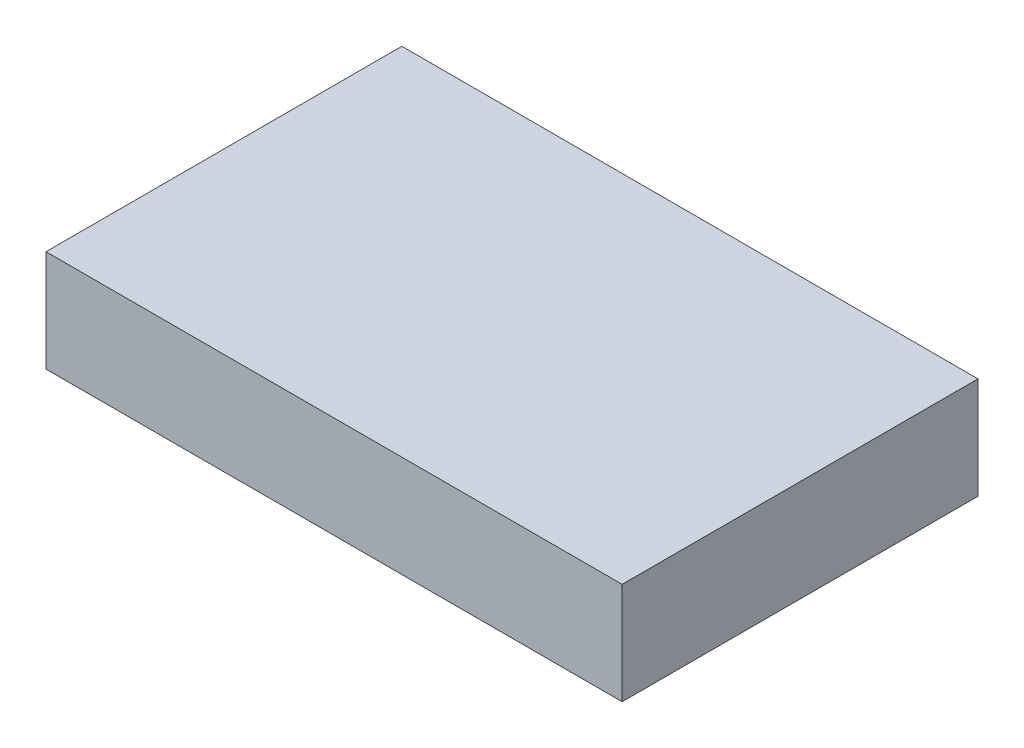
ISO-10303-21;
HEADER;
FILE_DESCRIPTION(('STEP AP214'),'2;1');
FILE_NAME('part.step','',(''),(''),'','','');
FILE_SCHEMA(('AUTOMOTIVE_DESIGN { 1 0 10303 214 1 1 1 1 }'));
ENDSEC;
DATA;
#1=APPLICATION_CONTEXT('core data for automotive mechanical design processes');
#2=APPLICATION_PROTOCOL_DEFINITION('international standard','automotive_design',2000,#1);
#3=PRODUCT_CONTEXT('',#1,'mechanical');
#4=PRODUCT('Part','Part','',(#3));
#5=PRODUCT_RELATED_PRODUCT_CATEGORY('part','',(#4));
#6=PRODUCT_DEFINITION_FORMATION('','',#4);
#7=PRODUCT_DEFINITION_CONTEXT('part definition',#1,'design');
#8=PRODUCT_DEFINITION('design','',#6,#7);
#9=PRODUCT_DEFINITION_SHAPE('','',#8);
#10=(LENGTH_UNIT() NAMED_UNIT(*) SI_UNIT(.MILLI.,.METRE.));
#11=(NAMED_UNIT(*) PLANE_ANGLE_UNIT() SI_UNIT($,.RADIAN.));
#12=(NAMED_UNIT(*) SI_UNIT($,.STERADIAN.) SOLID_ANGLE_UNIT());
#13=UNCERTAINTY_MEASURE_WITH_UNIT(LENGTH_MEASURE(1.E-05),#10,'distance_accuracy_value','');
#14=(GEOMETRIC_REPRESENTATION_CONTEXT(3) GLOBAL_UNCERTAINTY_ASSIGNED_CONTEXT((#13)) GLOBAL_UNIT_ASSIGNED_CONTEXT((#10,
#11,#12)) REPRESENTATION_CONTEXT('',''));
#15=CARTESIAN_POINT('',(0.,0.,0.));
#16=DIRECTION('',(0.,0.,1.));
#17=DIRECTION('',(1.,0.,0.));
#18=AXIS2_PLACEMENT_3D('',#15,#16,#17);
#19=CARTESIAN_POINT('',(17.,6.,10.5));
#20=DIRECTION('',(-1.,0.,0.));
#21=DIRECTION('',(0.,0.,1.));
#22=AXIS2_PLACEMENT_3D('',#19,#20,#21);
#23=PLANE('',#22);
#24=DIRECTION('',(0.,0.,-1.));
#25=VECTOR('',#24,1.);
#26=CARTESIAN_POINT('',(17.,0.,10.5));
#27=LINE('',#26,#25);
#28=CARTESIAN_POINT('',(17.,0.,10.5));
#29=VERTEX_POINT('',#28);
#30=CARTESIAN_POINT('',(17.,0.,-10.5));
#31=VERTEX_POINT('',#30);
#32=EDGE_CURVE('E113',#29,#31,#27,.T.);
#33=ORIENTED_EDGE('',*,*,#32,.T.);
#34=DIRECTION('',(0.,-1.,0.));
#35=VECTOR('',#34,1.);
#36=CARTESIAN_POINT('',(17.,6.,-10.5));
#37=LINE('',#36,#35);
#38=CARTESIAN_POINT('',(17.,6.,-10.5));
#39=VERTEX_POINT('',#38);
#40=EDGE_CURVE('E11',#39,#31,#37,.T.);
#41=ORIENTED_EDGE('',*,*,#40,.F.);
#42=DIRECTION('',(0.,0.,-1.));
#43=VECTOR('',#42,1.);
#44=CARTESIAN_POINT('',(17.,6.,10.5));
#45=LINE('',#44,#43);
#46=CARTESIAN_POINT('',(17.,6.,10.5));
#47=VERTEX_POINT('',#46);
#48=EDGE_CURVE('E97',#47,#39,#45,.T.);
#49=ORIENTED_EDGE('',*,*,#48,.F.);
#50=DIRECTION('',(0.,-1.,0.));
#51=VECTOR('',#50,1.);
#52=CARTESIAN_POINT('',(17.,6.,10.5));
#53=LINE('',#52,#51);
#54=EDGE_CURVE('E109',#47,#29,#53,.T.);
#55=ORIENTED_EDGE('',*,*,#54,.T.);
#56=EDGE_LOOP('',(#33,#41,#49,#55));
#57=FACE_BOUND('',#56,.T.);
#58=ADVANCED_FACE('F45',(#57),#23,.F.);
#59=CARTESIAN_POINT('',(-17.,6.,-10.5));
#60=DIRECTION('',(0.,0.,1.));
#61=DIRECTION('',(1.,0.,0.));
#62=AXIS2_PLACEMENT_3D('',#59,#60,#61);
#63=PLANE('',#62);
#64=DIRECTION('',(-1.,0.,0.));
#65=VECTOR('',#64,1.);
#66=CARTESIAN_POINT('',(-17.,0.,-10.5));
#67=LINE('',#66,#65);
#68=CARTESIAN_POINT('',(-17.,0.,-10.5));
#69=VERTEX_POINT('',#68);
#70=EDGE_CURVE('E102',#31,#69,#67,.T.);
#71=ORIENTED_EDGE('',*,*,#70,.T.);
#72=DIRECTION('',(0.,-1.,0.));
#73=VECTOR('',#72,1.);
#74=CARTESIAN_POINT('',(-17.,6.,-10.5));
#75=LINE('',#74,#73);
#76=CARTESIAN_POINT('',(-17.,6.,-10.5));
#77=VERTEX_POINT('',#76);
#78=EDGE_CURVE('E54',#77,#69,#75,.T.);
#79=ORIENTED_EDGE('',*,*,#78,.F.);
#80=DIRECTION('',(-1.,0.,0.));
#81=VECTOR('',#80,1.);
#82=CARTESIAN_POINT('',(-17.,6.,-10.5));
#83=LINE('',#82,#81);
#84=EDGE_CURVE('E92',#39,#77,#83,.T.);
#85=ORIENTED_EDGE('',*,*,#84,.F.);
#86=ORIENTED_EDGE('',*,*,#40,.T.);
#87=EDGE_LOOP('',(#71,#79,#85,#86));
#88=FACE_BOUND('',#87,.T.);
#89=ADVANCED_FACE('F101',(#88),#63,.F.);
#90=CARTESIAN_POINT('',(-17.,6.,10.5));
#91=DIRECTION('',(1.,0.,0.));
#92=DIRECTION('',(0.,0.,-1.));
#93=AXIS2_PLACEMENT_3D('',#90,#91,#92);
#94=PLANE('',#93);
#95=DIRECTION('',(0.,0.,1.));
#96=VECTOR('',#95,1.);
#97=CARTESIAN_POINT('',(-17.,0.,10.5));
#98=LINE('',#97,#96);
#99=CARTESIAN_POINT('',(-17.,0.,10.5));
#100=VERTEX_POINT('',#99);
#101=EDGE_CURVE('E79',#69,#100,#98,.T.);
#102=ORIENTED_EDGE('',*,*,#101,.T.);
#103=DIRECTION('',(0.,-1.,0.));
#104=VECTOR('',#103,1.);
#105=CARTESIAN_POINT('',(-17.,6.,10.5));
#106=LINE('',#105,#104);
#107=CARTESIAN_POINT('',(-17.,6.,10.5));
#108=VERTEX_POINT('',#107);
#109=EDGE_CURVE('E104',#108,#100,#106,.T.);
#110=ORIENTED_EDGE('',*,*,#109,.F.);
#111=DIRECTION('',(0.,0.,1.));
#112=VECTOR('',#111,1.);
#113=CARTESIAN_POINT('',(-17.,6.,10.5));
#114=LINE('',#113,#112);
#115=EDGE_CURVE('E95',#77,#108,#114,.T.);
#116=ORIENTED_EDGE('',*,*,#115,.F.);
#117=ORIENTED_EDGE('',*,*,#78,.T.);
#118=EDGE_LOOP('',(#102,#110,#116,#117));
#119=FACE_BOUND('',#118,.T.);
#120=ADVANCED_FACE('F105',(#119),#94,.F.);
#121=CARTESIAN_POINT('',(-17.,6.,10.5));
#122=DIRECTION('',(0.,0.,-1.));
#123=DIRECTION('',(-1.,0.,0.));
#124=AXIS2_PLACEMENT_3D('',#121,#122,#123);
#125=PLANE('',#124);
#126=DIRECTION('',(1.,0.,0.));
#127=VECTOR('',#126,1.);
#128=CARTESIAN_POINT('',(-17.,0.,10.5));
#129=LINE('',#128,#127);
#130=EDGE_CURVE('E85',#100,#29,#129,.T.);
#131=ORIENTED_EDGE('',*,*,#130,.T.);
#132=ORIENTED_EDGE('',*,*,#54,.F.);
#133=DIRECTION('',(1.,0.,0.));
#134=VECTOR('',#133,1.);
#135=CARTESIAN_POINT('',(-17.,6.,10.5));
#136=LINE('',#135,#134);
#137=EDGE_CURVE('E62',#108,#47,#136,.T.);
#138=ORIENTED_EDGE('',*,*,#137,.F.);
#139=ORIENTED_EDGE('',*,*,#109,.T.);
#140=EDGE_LOOP('',(#131,#132,#138,#139));
#141=FACE_BOUND('',#140,.T.);
#142=ADVANCED_FACE('F126',(#141),#125,.F.);
#143=CARTESIAN_POINT('',(0.,6.,0.));
#144=DIRECTION('',(0.,-1.,0.));
#145=DIRECTION('',(0.,0.,-1.));
#146=AXIS2_PLACEMENT_3D('',#143,#144,#145);
#147=PLANE('',#146);
#148=ORIENTED_EDGE('',*,*,#48,.T.);
#149=ORIENTED_EDGE('',*,*,#84,.T.);
#150=ORIENTED_EDGE('',*,*,#115,.T.);
#151=ORIENTED_EDGE('',*,*,#137,.T.);
#152=EDGE_LOOP('',(#148,#149,#150,#151));
#153=FACE_BOUND('',#152,.T.);
#154=ADVANCED_FACE('F93',(#153),#147,.F.);
#155=CARTESIAN_POINT('',(0.,0.,0.));
#156=DIRECTION('',(0.,-1.,0.));
#157=DIRECTION('',(0.,0.,-1.));
#158=AXIS2_PLACEMENT_3D('',#155,#156,#157);
#159=PLANE('',#158);
#160=ORIENTED_EDGE('',*,*,#32,.F.);
#161=ORIENTED_EDGE('',*,*,#130,.F.);
#162=ORIENTED_EDGE('',*,*,#101,.F.);
#163=ORIENTED_EDGE('',*,*,#70,.F.);
#164=EDGE_LOOP('',(#160,#161,#162,#163));
#165=FACE_BOUND('',#164,.T.);
#166=ADVANCED_FACE('F129',(#165),#159,.T.);
#167=CLOSED_SHELL('',(#58,#89,#120,#142,#154,#166));
#168=MANIFOLD_SOLID_BREP('B2',#167);
#169=ADVANCED_BREP_SHAPE_REPRESENTATION('',(#18,#168),#14);
#170=SHAPE_DEFINITION_REPRESENTATION(#9,#169);
ENDSEC;
END-ISO-10303-21;
